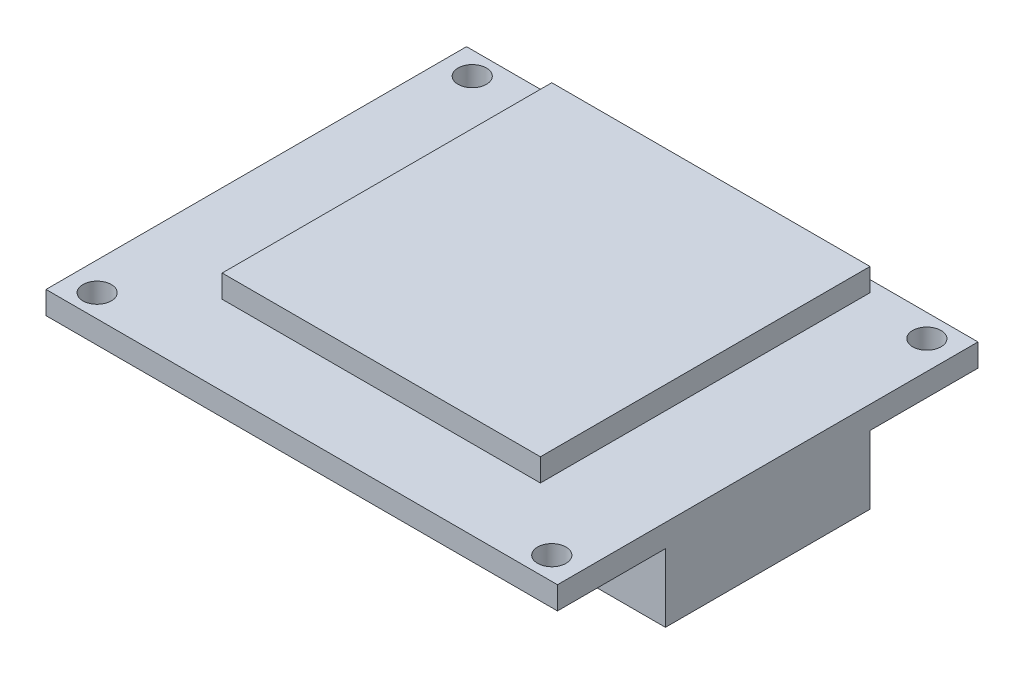
ISO-10303-21;
HEADER;
FILE_DESCRIPTION(('STEP AP214'),'2;1');
FILE_NAME('part.step','',(''),(''),'','','');
FILE_SCHEMA(('AUTOMOTIVE_DESIGN { 1 0 10303 214 1 1 1 1 }'));
ENDSEC;
DATA;
#1=APPLICATION_CONTEXT('core data for automotive mechanical design processes');
#2=APPLICATION_PROTOCOL_DEFINITION('international standard','automotive_design',2000,#1);
#3=PRODUCT_CONTEXT('',#1,'mechanical');
#4=PRODUCT('Part','Part','',(#3));
#5=PRODUCT_RELATED_PRODUCT_CATEGORY('part','',(#4));
#6=PRODUCT_DEFINITION_FORMATION('','',#4);
#7=PRODUCT_DEFINITION_CONTEXT('part definition',#1,'design');
#8=PRODUCT_DEFINITION('design','',#6,#7);
#9=PRODUCT_DEFINITION_SHAPE('','',#8);
#10=(LENGTH_UNIT() NAMED_UNIT(*) SI_UNIT(.MILLI.,.METRE.));
#11=(NAMED_UNIT(*) PLANE_ANGLE_UNIT() SI_UNIT($,.RADIAN.));
#12=(NAMED_UNIT(*) SI_UNIT($,.STERADIAN.) SOLID_ANGLE_UNIT());
#13=UNCERTAINTY_MEASURE_WITH_UNIT(LENGTH_MEASURE(1.E-05),#10,'distance_accuracy_value','');
#14=(GEOMETRIC_REPRESENTATION_CONTEXT(3) GLOBAL_UNCERTAINTY_ASSIGNED_CONTEXT((#13)) GLOBAL_UNIT_ASSIGNED_CONTEXT((#10,
#11,#12)) REPRESENTATION_CONTEXT('',''));
#15=CARTESIAN_POINT('',(0.,0.,0.));
#16=DIRECTION('',(0.,0.,1.));
#17=DIRECTION('',(1.,0.,0.));
#18=AXIS2_PLACEMENT_3D('',#15,#16,#17);
#19=CARTESIAN_POINT('',(0.,2.,0.));
#20=DIRECTION('',(0.,-1.,0.));
#21=DIRECTION('',(0.,0.,-1.));
#22=AXIS2_PLACEMENT_3D('',#19,#20,#21);
#23=PLANE('',#22);
#24=CARTESIAN_POINT('',(2.5,2.,-2.));
#25=DIRECTION('',(0.,1.,0.));
#26=DIRECTION('',(0.,0.,-1.));
#27=AXIS2_PLACEMENT_3D('',#24,#25,#26);
#28=CIRCLE('',#27,1.25);
#29=CARTESIAN_POINT('',(2.5,2.,-3.25));
#30=VERTEX_POINT('',#29);
#31=EDGE_CURVE('E146',#30,#30,#28,.T.);
#32=ORIENTED_EDGE('',*,*,#31,.F.);
#33=EDGE_LOOP('',(#32));
#34=FACE_BOUND('',#33,.T.);
#35=CARTESIAN_POINT('',(42.5,2.,-1.99999999999999));
#36=DIRECTION('',(0.,1.,0.));
#37=DIRECTION('',(0.,0.,1.));
#38=AXIS2_PLACEMENT_3D('',#35,#36,#37);
#39=CIRCLE('',#38,1.25);
#40=CARTESIAN_POINT('',(42.5,2.,-0.74999999999999));
#41=VERTEX_POINT('',#40);
#42=EDGE_CURVE('E165',#41,#41,#39,.T.);
#43=ORIENTED_EDGE('',*,*,#42,.F.);
#44=EDGE_LOOP('',(#43));
#45=FACE_BOUND('',#44,.T.);
#46=CARTESIAN_POINT('',(42.5,2.,-35.));
#47=DIRECTION('',(0.,1.,0.));
#48=DIRECTION('',(0.,0.,-1.));
#49=AXIS2_PLACEMENT_3D('',#46,#47,#48);
#50=CIRCLE('',#49,1.25);
#51=CARTESIAN_POINT('',(42.5,2.,-36.25));
#52=VERTEX_POINT('',#51);
#53=EDGE_CURVE('E159',#52,#52,#50,.T.);
#54=ORIENTED_EDGE('',*,*,#53,.F.);
#55=EDGE_LOOP('',(#54));
#56=FACE_BOUND('',#55,.T.);
#57=CARTESIAN_POINT('',(2.5,2.,-35.));
#58=DIRECTION('',(0.,1.,0.));
#59=DIRECTION('',(0.,0.,1.));
#60=AXIS2_PLACEMENT_3D('',#57,#58,#59);
#61=CIRCLE('',#60,1.25);
#62=CARTESIAN_POINT('',(2.5,2.,-33.75));
#63=VERTEX_POINT('',#62);
#64=EDGE_CURVE('E158',#63,#63,#61,.T.);
#65=ORIENTED_EDGE('',*,*,#64,.F.);
#66=EDGE_LOOP('',(#65));
#67=FACE_BOUND('',#66,.T.);
#68=DIRECTION('',(0.,0.,1.));
#69=VECTOR('',#68,1.);
#70=CARTESIAN_POINT('',(0.,2.,0.));
#71=LINE('',#70,#69);
#72=CARTESIAN_POINT('',(0.,2.,-37.));
#73=VERTEX_POINT('',#72);
#74=CARTESIAN_POINT('',(0.,2.,0.));
#75=VERTEX_POINT('',#74);
#76=EDGE_CURVE('E209',#73,#75,#71,.T.);
#77=ORIENTED_EDGE('',*,*,#76,.T.);
#78=DIRECTION('',(1.,0.,0.));
#79=VECTOR('',#78,1.);
#80=CARTESIAN_POINT('',(0.,2.,0.));
#81=LINE('',#80,#79);
#82=CARTESIAN_POINT('',(45.,2.,0.));
#83=VERTEX_POINT('',#82);
#84=EDGE_CURVE('E212',#75,#83,#81,.T.);
#85=ORIENTED_EDGE('',*,*,#84,.T.);
#86=DIRECTION('',(0.,0.,-1.));
#87=VECTOR('',#86,1.);
#88=CARTESIAN_POINT('',(45.,2.,0.));
#89=LINE('',#88,#87);
#90=CARTESIAN_POINT('',(45.,2.,-37.));
#91=VERTEX_POINT('',#90);
#92=EDGE_CURVE('E215',#83,#91,#89,.T.);
#93=ORIENTED_EDGE('',*,*,#92,.T.);
#94=DIRECTION('',(-1.,0.,0.));
#95=VECTOR('',#94,1.);
#96=CARTESIAN_POINT('',(0.,2.,-37.));
#97=LINE('',#96,#95);
#98=EDGE_CURVE('E217',#91,#73,#97,.T.);
#99=ORIENTED_EDGE('',*,*,#98,.T.);
#100=EDGE_LOOP('',(#77,#85,#93,#99));
#101=FACE_BOUND('',#100,.T.);
#102=DIRECTION('',(0.,0.,1.));
#103=VECTOR('',#102,1.);
#104=CARTESIAN_POINT('',(8.5,2.,-36.));
#105=LINE('',#104,#103);
#106=CARTESIAN_POINT('',(8.5,2.,-36.));
#107=VERTEX_POINT('',#106);
#108=CARTESIAN_POINT('',(8.5,2.,-7.));
#109=VERTEX_POINT('',#108);
#110=EDGE_CURVE('E173',#107,#109,#105,.T.);
#111=ORIENTED_EDGE('',*,*,#110,.F.);
#112=DIRECTION('',(-1.,0.,0.));
#113=VECTOR('',#112,1.);
#114=CARTESIAN_POINT('',(36.5,2.,-36.));
#115=LINE('',#114,#113);
#116=CARTESIAN_POINT('',(36.5,2.,-36.));
#117=VERTEX_POINT('',#116);
#118=EDGE_CURVE('E180',#117,#107,#115,.T.);
#119=ORIENTED_EDGE('',*,*,#118,.F.);
#120=DIRECTION('',(0.,0.,-1.));
#121=VECTOR('',#120,1.);
#122=CARTESIAN_POINT('',(36.5,2.,-36.));
#123=LINE('',#122,#121);
#124=CARTESIAN_POINT('',(36.5,2.,-6.99999999999999));
#125=VERTEX_POINT('',#124);
#126=EDGE_CURVE('E192',#125,#117,#123,.T.);
#127=ORIENTED_EDGE('',*,*,#126,.F.);
#128=DIRECTION('',(1.,0.,0.));
#129=VECTOR('',#128,1.);
#130=CARTESIAN_POINT('',(8.5,2.,-7.));
#131=LINE('',#130,#129);
#132=EDGE_CURVE('E189',#109,#125,#131,.T.);
#133=ORIENTED_EDGE('',*,*,#132,.F.);
#134=EDGE_LOOP('',(#111,#119,#127,#133));
#135=FACE_BOUND('',#134,.T.);
#136=ADVANCED_FACE('F35',(#34,#45,#56,#67,#101,#135),#23,.F.);
#137=CARTESIAN_POINT('',(0.,2.,0.));
#138=DIRECTION('',(1.,0.,0.));
#139=DIRECTION('',(0.,0.,-1.));
#140=AXIS2_PLACEMENT_3D('',#137,#138,#139);
#141=PLANE('',#140);
#142=DIRECTION('',(0.,0.,1.));
#143=VECTOR('',#142,1.);
#144=CARTESIAN_POINT('',(0.,0.,0.));
#145=LINE('',#144,#143);
#146=CARTESIAN_POINT('',(0.,0.,-37.));
#147=VERTEX_POINT('',#146);
#148=CARTESIAN_POINT('',(0.,0.,0.));
#149=VERTEX_POINT('',#148);
#150=EDGE_CURVE('E208',#147,#149,#145,.T.);
#151=ORIENTED_EDGE('',*,*,#150,.T.);
#152=DIRECTION('',(0.,-1.,0.));
#153=VECTOR('',#152,1.);
#154=CARTESIAN_POINT('',(0.,2.,0.));
#155=LINE('',#154,#153);
#156=EDGE_CURVE('E11',#75,#149,#155,.T.);
#157=ORIENTED_EDGE('',*,*,#156,.F.);
#158=ORIENTED_EDGE('',*,*,#76,.F.);
#159=DIRECTION('',(0.,-1.,0.));
#160=VECTOR('',#159,1.);
#161=CARTESIAN_POINT('',(0.,2.,-37.));
#162=LINE('',#161,#160);
#163=EDGE_CURVE('E219',#73,#147,#162,.T.);
#164=ORIENTED_EDGE('',*,*,#163,.T.);
#165=EDGE_LOOP('',(#151,#157,#158,#164));
#166=FACE_BOUND('',#165,.T.);
#167=ADVANCED_FACE('F37',(#166),#141,.F.);
#168=CARTESIAN_POINT('',(0.,2.,0.));
#169=DIRECTION('',(0.,0.,-1.));
#170=DIRECTION('',(-1.,0.,0.));
#171=AXIS2_PLACEMENT_3D('',#168,#169,#170);
#172=PLANE('',#171);
#173=DIRECTION('',(1.,0.,0.));
#174=VECTOR('',#173,1.);
#175=CARTESIAN_POINT('',(0.,0.,0.));
#176=LINE('',#175,#174);
#177=CARTESIAN_POINT('',(45.,0.,0.));
#178=VERTEX_POINT('',#177);
#179=EDGE_CURVE('E222',#149,#178,#176,.T.);
#180=ORIENTED_EDGE('',*,*,#179,.T.);
#181=DIRECTION('',(0.,-1.,0.));
#182=VECTOR('',#181,1.);
#183=CARTESIAN_POINT('',(45.,2.,0.));
#184=LINE('',#183,#182);
#185=EDGE_CURVE('E43',#83,#178,#184,.T.);
#186=ORIENTED_EDGE('',*,*,#185,.F.);
#187=ORIENTED_EDGE('',*,*,#84,.F.);
#188=ORIENTED_EDGE('',*,*,#156,.T.);
#189=EDGE_LOOP('',(#180,#186,#187,#188));
#190=FACE_BOUND('',#189,.T.);
#191=ADVANCED_FACE('F268',(#190),#172,.F.);
#192=CARTESIAN_POINT('',(45.,2.,0.));
#193=DIRECTION('',(-1.,0.,0.));
#194=DIRECTION('',(0.,0.,1.));
#195=AXIS2_PLACEMENT_3D('',#192,#193,#194);
#196=PLANE('',#195);
#197=DIRECTION('',(0.,0.,-1.));
#198=VECTOR('',#197,1.);
#199=CARTESIAN_POINT('',(45.,0.,0.));
#200=LINE('',#199,#198);
#201=CARTESIAN_POINT('',(45.,0.,-9.5));
#202=VERTEX_POINT('',#201);
#203=EDGE_CURVE('E224',#178,#202,#200,.T.);
#204=ORIENTED_EDGE('',*,*,#203,.T.);
#205=DIRECTION('',(0.,1.,0.));
#206=VECTOR('',#205,1.);
#207=CARTESIAN_POINT('',(45.,-6.,-9.5));
#208=LINE('',#207,#206);
#209=CARTESIAN_POINT('',(45.,-6.,-9.5));
#210=VERTEX_POINT('',#209);
#211=EDGE_CURVE('E249',#210,#202,#208,.T.);
#212=ORIENTED_EDGE('',*,*,#211,.F.);
#213=DIRECTION('',(0.,0.,1.));
#214=VECTOR('',#213,1.);
#215=CARTESIAN_POINT('',(45.,-6.,-9.5));
#216=LINE('',#215,#214);
#217=CARTESIAN_POINT('',(45.,-6.,-27.5));
#218=VERTEX_POINT('',#217);
#219=EDGE_CURVE('E138',#218,#210,#216,.T.);
#220=ORIENTED_EDGE('',*,*,#219,.F.);
#221=DIRECTION('',(0.,1.,0.));
#222=VECTOR('',#221,1.);
#223=CARTESIAN_POINT('',(45.,-6.,-27.5));
#224=LINE('',#223,#222);
#225=CARTESIAN_POINT('',(45.,0.,-27.5));
#226=VERTEX_POINT('',#225);
#227=EDGE_CURVE('E151',#218,#226,#224,.T.);
#228=ORIENTED_EDGE('',*,*,#227,.T.);
#229=CARTESIAN_POINT('',(45.,0.,-37.));
#230=VERTEX_POINT('',#229);
#231=EDGE_CURVE('E56',#226,#230,#200,.T.);
#232=ORIENTED_EDGE('',*,*,#231,.T.);
#233=DIRECTION('',(0.,-1.,0.));
#234=VECTOR('',#233,1.);
#235=CARTESIAN_POINT('',(45.,2.,-37.));
#236=LINE('',#235,#234);
#237=EDGE_CURVE('E230',#91,#230,#236,.T.);
#238=ORIENTED_EDGE('',*,*,#237,.F.);
#239=ORIENTED_EDGE('',*,*,#92,.F.);
#240=ORIENTED_EDGE('',*,*,#185,.T.);
#241=EDGE_LOOP('',(#204,#212,#220,#228,#232,#238,#239,#240));
#242=FACE_BOUND('',#241,.T.);
#243=ADVANCED_FACE('F237',(#242),#196,.F.);
#244=CARTESIAN_POINT('',(0.,2.,-37.));
#245=DIRECTION('',(0.,0.,1.));
#246=DIRECTION('',(1.,0.,0.));
#247=AXIS2_PLACEMENT_3D('',#244,#245,#246);
#248=PLANE('',#247);
#249=DIRECTION('',(-1.,0.,0.));
#250=VECTOR('',#249,1.);
#251=CARTESIAN_POINT('',(0.,0.,-37.));
#252=LINE('',#251,#250);
#253=EDGE_CURVE('E213',#230,#147,#252,.T.);
#254=ORIENTED_EDGE('',*,*,#253,.T.);
#255=ORIENTED_EDGE('',*,*,#163,.F.);
#256=ORIENTED_EDGE('',*,*,#98,.F.);
#257=ORIENTED_EDGE('',*,*,#237,.T.);
#258=EDGE_LOOP('',(#254,#255,#256,#257));
#259=FACE_BOUND('',#258,.T.);
#260=ADVANCED_FACE('F278',(#259),#248,.F.);
#261=CARTESIAN_POINT('',(0.,0.,0.));
#262=DIRECTION('',(0.,-1.,0.));
#263=DIRECTION('',(0.,0.,-1.));
#264=AXIS2_PLACEMENT_3D('',#261,#262,#263);
#265=PLANE('',#264);
#266=DIRECTION('',(-1.,0.,0.));
#267=VECTOR('',#266,1.);
#268=CARTESIAN_POINT('',(37.,0.,-9.5));
#269=LINE('',#268,#267);
#270=CARTESIAN_POINT('',(37.,0.,-9.5));
#271=VERTEX_POINT('',#270);
#272=EDGE_CURVE('E145',#202,#271,#269,.T.);
#273=ORIENTED_EDGE('',*,*,#272,.F.);
#274=ORIENTED_EDGE('',*,*,#203,.F.);
#275=ORIENTED_EDGE('',*,*,#179,.F.);
#276=ORIENTED_EDGE('',*,*,#150,.F.);
#277=ORIENTED_EDGE('',*,*,#253,.F.);
#278=ORIENTED_EDGE('',*,*,#231,.F.);
#279=DIRECTION('',(1.,0.,0.));
#280=VECTOR('',#279,1.);
#281=CARTESIAN_POINT('',(37.,0.,-27.5));
#282=LINE('',#281,#280);
#283=CARTESIAN_POINT('',(37.,0.,-27.5));
#284=VERTEX_POINT('',#283);
#285=EDGE_CURVE('E142',#284,#226,#282,.T.);
#286=ORIENTED_EDGE('',*,*,#285,.F.);
#287=DIRECTION('',(0.,0.,-1.));
#288=VECTOR('',#287,1.);
#289=CARTESIAN_POINT('',(37.,0.,-9.5));
#290=LINE('',#289,#288);
#291=EDGE_CURVE('E50',#271,#284,#290,.T.);
#292=ORIENTED_EDGE('',*,*,#291,.F.);
#293=EDGE_LOOP('',(#273,#274,#275,#276,#277,#278,#286,#292));
#294=FACE_BOUND('',#293,.T.);
#295=CARTESIAN_POINT('',(2.5,0.,-2.));
#296=DIRECTION('',(0.,1.,0.));
#297=DIRECTION('',(0.,0.,-1.));
#298=AXIS2_PLACEMENT_3D('',#295,#296,#297);
#299=CIRCLE('',#298,1.25);
#300=CARTESIAN_POINT('',(2.5,0.,-3.25));
#301=VERTEX_POINT('',#300);
#302=EDGE_CURVE('E149',#301,#301,#299,.T.);
#303=ORIENTED_EDGE('',*,*,#302,.T.);
#304=EDGE_LOOP('',(#303));
#305=FACE_BOUND('',#304,.T.);
#306=CARTESIAN_POINT('',(42.5,0.,-1.99999999999999));
#307=DIRECTION('',(0.,1.,0.));
#308=DIRECTION('',(0.,0.,1.));
#309=AXIS2_PLACEMENT_3D('',#306,#307,#308);
#310=CIRCLE('',#309,1.25);
#311=CARTESIAN_POINT('',(42.5,0.,-0.74999999999999));
#312=VERTEX_POINT('',#311);
#313=EDGE_CURVE('E162',#312,#312,#310,.T.);
#314=ORIENTED_EDGE('',*,*,#313,.T.);
#315=EDGE_LOOP('',(#314));
#316=FACE_BOUND('',#315,.T.);
#317=CARTESIAN_POINT('',(42.5,0.,-35.));
#318=DIRECTION('',(0.,1.,0.));
#319=DIRECTION('',(0.,0.,-1.));
#320=AXIS2_PLACEMENT_3D('',#317,#318,#319);
#321=CIRCLE('',#320,1.25);
#322=CARTESIAN_POINT('',(42.5,0.,-36.25));
#323=VERTEX_POINT('',#322);
#324=EDGE_CURVE('E155',#323,#323,#321,.T.);
#325=ORIENTED_EDGE('',*,*,#324,.T.);
#326=EDGE_LOOP('',(#325));
#327=FACE_BOUND('',#326,.T.);
#328=CARTESIAN_POINT('',(2.5,0.,-35.));
#329=DIRECTION('',(0.,1.,0.));
#330=DIRECTION('',(0.,0.,1.));
#331=AXIS2_PLACEMENT_3D('',#328,#329,#330);
#332=CIRCLE('',#331,1.25);
#333=CARTESIAN_POINT('',(2.5,0.,-33.75));
#334=VERTEX_POINT('',#333);
#335=EDGE_CURVE('E170',#334,#334,#332,.T.);
#336=ORIENTED_EDGE('',*,*,#335,.T.);
#337=EDGE_LOOP('',(#336));
#338=FACE_BOUND('',#337,.T.);
#339=ADVANCED_FACE('F240',(#294,#305,#316,#327,#338),#265,.T.);
#340=CARTESIAN_POINT('',(8.5,4.,-36.));
#341=DIRECTION('',(1.,0.,0.));
#342=DIRECTION('',(0.,0.,-1.));
#343=AXIS2_PLACEMENT_3D('',#340,#341,#342);
#344=PLANE('',#343);
#345=ORIENTED_EDGE('',*,*,#110,.T.);
#346=DIRECTION('',(0.,-1.,0.));
#347=VECTOR('',#346,1.);
#348=CARTESIAN_POINT('',(8.5,4.,-7.));
#349=LINE('',#348,#347);
#350=CARTESIAN_POINT('',(8.5,4.,-7.));
#351=VERTEX_POINT('',#350);
#352=EDGE_CURVE('E205',#351,#109,#349,.T.);
#353=ORIENTED_EDGE('',*,*,#352,.F.);
#354=DIRECTION('',(0.,0.,1.));
#355=VECTOR('',#354,1.);
#356=CARTESIAN_POINT('',(8.5,4.,-36.));
#357=LINE('',#356,#355);
#358=CARTESIAN_POINT('',(8.5,4.,-36.));
#359=VERTEX_POINT('',#358);
#360=EDGE_CURVE('E176',#359,#351,#357,.T.);
#361=ORIENTED_EDGE('',*,*,#360,.F.);
#362=DIRECTION('',(0.,-1.,0.));
#363=VECTOR('',#362,1.);
#364=CARTESIAN_POINT('',(8.5,4.,-36.));
#365=LINE('',#364,#363);
#366=EDGE_CURVE('E186',#359,#107,#365,.T.);
#367=ORIENTED_EDGE('',*,*,#366,.T.);
#368=EDGE_LOOP('',(#345,#353,#361,#367));
#369=FACE_BOUND('',#368,.T.);
#370=ADVANCED_FACE('F274',(#369),#344,.F.);
#371=CARTESIAN_POINT('',(8.5,4.,-7.));
#372=DIRECTION('',(0.,0.,-1.));
#373=DIRECTION('',(-1.,0.,0.));
#374=AXIS2_PLACEMENT_3D('',#371,#372,#373);
#375=PLANE('',#374);
#376=ORIENTED_EDGE('',*,*,#132,.T.);
#377=DIRECTION('',(0.,-1.,0.));
#378=VECTOR('',#377,1.);
#379=CARTESIAN_POINT('',(36.5,4.,-6.99999999999999));
#380=LINE('',#379,#378);
#381=CARTESIAN_POINT('',(36.5,4.,-6.99999999999999));
#382=VERTEX_POINT('',#381);
#383=EDGE_CURVE('E202',#382,#125,#380,.T.);
#384=ORIENTED_EDGE('',*,*,#383,.F.);
#385=DIRECTION('',(1.,0.,0.));
#386=VECTOR('',#385,1.);
#387=CARTESIAN_POINT('',(8.5,4.,-7.));
#388=LINE('',#387,#386);
#389=EDGE_CURVE('E179',#351,#382,#388,.T.);
#390=ORIENTED_EDGE('',*,*,#389,.F.);
#391=ORIENTED_EDGE('',*,*,#352,.T.);
#392=EDGE_LOOP('',(#376,#384,#390,#391));
#393=FACE_BOUND('',#392,.T.);
#394=ADVANCED_FACE('F307',(#393),#375,.F.);
#395=CARTESIAN_POINT('',(36.5,4.,-36.));
#396=DIRECTION('',(-1.,0.,0.));
#397=DIRECTION('',(0.,0.,1.));
#398=AXIS2_PLACEMENT_3D('',#395,#396,#397);
#399=PLANE('',#398);
#400=ORIENTED_EDGE('',*,*,#126,.T.);
#401=DIRECTION('',(0.,-1.,0.));
#402=VECTOR('',#401,1.);
#403=CARTESIAN_POINT('',(36.5,4.,-36.));
#404=LINE('',#403,#402);
#405=CARTESIAN_POINT('',(36.5,4.,-36.));
#406=VERTEX_POINT('',#405);
#407=EDGE_CURVE('E199',#406,#117,#404,.T.);
#408=ORIENTED_EDGE('',*,*,#407,.F.);
#409=DIRECTION('',(0.,0.,-1.));
#410=VECTOR('',#409,1.);
#411=CARTESIAN_POINT('',(36.5,4.,-36.));
#412=LINE('',#411,#410);
#413=EDGE_CURVE('E182',#382,#406,#412,.T.);
#414=ORIENTED_EDGE('',*,*,#413,.F.);
#415=ORIENTED_EDGE('',*,*,#383,.T.);
#416=EDGE_LOOP('',(#400,#408,#414,#415));
#417=FACE_BOUND('',#416,.T.);
#418=ADVANCED_FACE('F305',(#417),#399,.F.);
#419=CARTESIAN_POINT('',(36.5,4.,-36.));
#420=DIRECTION('',(0.,0.,1.));
#421=DIRECTION('',(1.,0.,0.));
#422=AXIS2_PLACEMENT_3D('',#419,#420,#421);
#423=PLANE('',#422);
#424=ORIENTED_EDGE('',*,*,#118,.T.);
#425=ORIENTED_EDGE('',*,*,#366,.F.);
#426=DIRECTION('',(-1.,0.,0.));
#427=VECTOR('',#426,1.);
#428=CARTESIAN_POINT('',(36.5,4.,-36.));
#429=LINE('',#428,#427);
#430=EDGE_CURVE('E184',#406,#359,#429,.T.);
#431=ORIENTED_EDGE('',*,*,#430,.F.);
#432=ORIENTED_EDGE('',*,*,#407,.T.);
#433=EDGE_LOOP('',(#424,#425,#431,#432));
#434=FACE_BOUND('',#433,.T.);
#435=ADVANCED_FACE('F296',(#434),#423,.F.);
#436=CARTESIAN_POINT('',(0.,4.,0.));
#437=DIRECTION('',(0.,1.,0.));
#438=DIRECTION('',(0.,0.,1.));
#439=AXIS2_PLACEMENT_3D('',#436,#437,#438);
#440=PLANE('',#439);
#441=ORIENTED_EDGE('',*,*,#360,.T.);
#442=ORIENTED_EDGE('',*,*,#389,.T.);
#443=ORIENTED_EDGE('',*,*,#413,.T.);
#444=ORIENTED_EDGE('',*,*,#430,.T.);
#445=EDGE_LOOP('',(#441,#442,#443,#444));
#446=FACE_BOUND('',#445,.T.);
#447=ADVANCED_FACE('F301',(#446),#440,.T.);
#448=CARTESIAN_POINT('',(2.5,0.,-35.));
#449=DIRECTION('',(0.,1.,0.));
#450=DIRECTION('',(0.,0.,1.));
#451=AXIS2_PLACEMENT_3D('',#448,#449,#450);
#452=CYLINDRICAL_SURFACE('',#451,1.25);
#453=ORIENTED_EDGE('',*,*,#335,.F.);
#454=EDGE_LOOP('',(#453));
#455=FACE_BOUND('',#454,.T.);
#456=ORIENTED_EDGE('',*,*,#64,.T.);
#457=EDGE_LOOP('',(#456));
#458=FACE_BOUND('',#457,.T.);
#459=ADVANCED_FACE('F319',(#455,#458),#452,.F.);
#460=CARTESIAN_POINT('',(42.5,0.,-35.));
#461=DIRECTION('',(0.,1.,0.));
#462=DIRECTION('',(0.,0.,1.));
#463=AXIS2_PLACEMENT_3D('',#460,#461,#462);
#464=CYLINDRICAL_SURFACE('',#463,1.25);
#465=ORIENTED_EDGE('',*,*,#324,.F.);
#466=EDGE_LOOP('',(#465));
#467=FACE_BOUND('',#466,.T.);
#468=ORIENTED_EDGE('',*,*,#53,.T.);
#469=EDGE_LOOP('',(#468));
#470=FACE_BOUND('',#469,.T.);
#471=ADVANCED_FACE('F322',(#467,#470),#464,.F.);
#472=CARTESIAN_POINT('',(42.5,0.,-1.99999999999999));
#473=DIRECTION('',(0.,1.,0.));
#474=DIRECTION('',(0.,0.,1.));
#475=AXIS2_PLACEMENT_3D('',#472,#473,#474);
#476=CYLINDRICAL_SURFACE('',#475,1.25);
#477=ORIENTED_EDGE('',*,*,#313,.F.);
#478=EDGE_LOOP('',(#477));
#479=FACE_BOUND('',#478,.T.);
#480=ORIENTED_EDGE('',*,*,#42,.T.);
#481=EDGE_LOOP('',(#480));
#482=FACE_BOUND('',#481,.T.);
#483=ADVANCED_FACE('F327',(#479,#482),#476,.F.);
#484=CARTESIAN_POINT('',(2.5,0.,-2.));
#485=DIRECTION('',(0.,1.,0.));
#486=DIRECTION('',(0.,0.,1.));
#487=AXIS2_PLACEMENT_3D('',#484,#485,#486);
#488=CYLINDRICAL_SURFACE('',#487,1.25);
#489=ORIENTED_EDGE('',*,*,#302,.F.);
#490=EDGE_LOOP('',(#489));
#491=FACE_BOUND('',#490,.T.);
#492=ORIENTED_EDGE('',*,*,#31,.T.);
#493=EDGE_LOOP('',(#492));
#494=FACE_BOUND('',#493,.T.);
#495=ADVANCED_FACE('F324',(#491,#494),#488,.F.);
#496=CARTESIAN_POINT('',(37.,-6.,-9.5));
#497=DIRECTION('',(0.,0.,-1.));
#498=DIRECTION('',(-1.,0.,0.));
#499=AXIS2_PLACEMENT_3D('',#496,#497,#498);
#500=PLANE('',#499);
#501=ORIENTED_EDGE('',*,*,#272,.T.);
#502=DIRECTION('',(0.,1.,0.));
#503=VECTOR('',#502,1.);
#504=CARTESIAN_POINT('',(37.,-6.,-9.5));
#505=LINE('',#504,#503);
#506=CARTESIAN_POINT('',(37.,-6.,-9.5));
#507=VERTEX_POINT('',#506);
#508=EDGE_CURVE('E126',#507,#271,#505,.T.);
#509=ORIENTED_EDGE('',*,*,#508,.F.);
#510=DIRECTION('',(-1.,0.,0.));
#511=VECTOR('',#510,1.);
#512=CARTESIAN_POINT('',(37.,-6.,-9.5));
#513=LINE('',#512,#511);
#514=EDGE_CURVE('E133',#210,#507,#513,.T.);
#515=ORIENTED_EDGE('',*,*,#514,.F.);
#516=ORIENTED_EDGE('',*,*,#211,.T.);
#517=EDGE_LOOP('',(#501,#509,#515,#516));
#518=FACE_BOUND('',#517,.T.);
#519=ADVANCED_FACE('F144',(#518),#500,.F.);
#520=CARTESIAN_POINT('',(37.,-6.,-9.5));
#521=DIRECTION('',(1.,0.,0.));
#522=DIRECTION('',(0.,0.,-1.));
#523=AXIS2_PLACEMENT_3D('',#520,#521,#522);
#524=PLANE('',#523);
#525=ORIENTED_EDGE('',*,*,#291,.T.);
#526=DIRECTION('',(0.,1.,0.));
#527=VECTOR('',#526,1.);
#528=CARTESIAN_POINT('',(37.,-6.,-27.5));
#529=LINE('',#528,#527);
#530=CARTESIAN_POINT('',(37.,-6.,-27.5));
#531=VERTEX_POINT('',#530);
#532=EDGE_CURVE('E129',#531,#284,#529,.T.);
#533=ORIENTED_EDGE('',*,*,#532,.F.);
#534=DIRECTION('',(0.,0.,-1.));
#535=VECTOR('',#534,1.);
#536=CARTESIAN_POINT('',(37.,-6.,-9.5));
#537=LINE('',#536,#535);
#538=EDGE_CURVE('E122',#507,#531,#537,.T.);
#539=ORIENTED_EDGE('',*,*,#538,.F.);
#540=ORIENTED_EDGE('',*,*,#508,.T.);
#541=EDGE_LOOP('',(#525,#533,#539,#540));
#542=FACE_BOUND('',#541,.T.);
#543=ADVANCED_FACE('F124',(#542),#524,.F.);
#544=CARTESIAN_POINT('',(37.,-6.,-27.5));
#545=DIRECTION('',(0.,0.,1.));
#546=DIRECTION('',(1.,0.,0.));
#547=AXIS2_PLACEMENT_3D('',#544,#545,#546);
#548=PLANE('',#547);
#549=ORIENTED_EDGE('',*,*,#285,.T.);
#550=ORIENTED_EDGE('',*,*,#227,.F.);
#551=DIRECTION('',(1.,0.,0.));
#552=VECTOR('',#551,1.);
#553=CARTESIAN_POINT('',(37.,-6.,-27.5));
#554=LINE('',#553,#552);
#555=EDGE_CURVE('E132',#531,#218,#554,.T.);
#556=ORIENTED_EDGE('',*,*,#555,.F.);
#557=ORIENTED_EDGE('',*,*,#532,.T.);
#558=EDGE_LOOP('',(#549,#550,#556,#557));
#559=FACE_BOUND('',#558,.T.);
#560=ADVANCED_FACE('F253',(#559),#548,.F.);
#561=CARTESIAN_POINT('',(0.,-6.,0.));
#562=DIRECTION('',(0.,1.,0.));
#563=DIRECTION('',(0.,0.,1.));
#564=AXIS2_PLACEMENT_3D('',#561,#562,#563);
#565=PLANE('',#564);
#566=ORIENTED_EDGE('',*,*,#514,.T.);
#567=ORIENTED_EDGE('',*,*,#538,.T.);
#568=ORIENTED_EDGE('',*,*,#555,.T.);
#569=ORIENTED_EDGE('',*,*,#219,.T.);
#570=EDGE_LOOP('',(#566,#567,#568,#569));
#571=FACE_BOUND('',#570,.T.);
#572=ADVANCED_FACE('F136',(#571),#565,.F.);
#573=CLOSED_SHELL('',(#136,#167,#191,#243,#260,#339,#370,#394,#418,#435,#447,#459,#471,#483,
#495,#519,#543,#560,#572));
#574=MANIFOLD_SOLID_BREP('B2',#573);
#575=ADVANCED_BREP_SHAPE_REPRESENTATION('',(#18,#574),#14);
#576=SHAPE_DEFINITION_REPRESENTATION(#9,#575);
ENDSEC;
END-ISO-10303-21;
